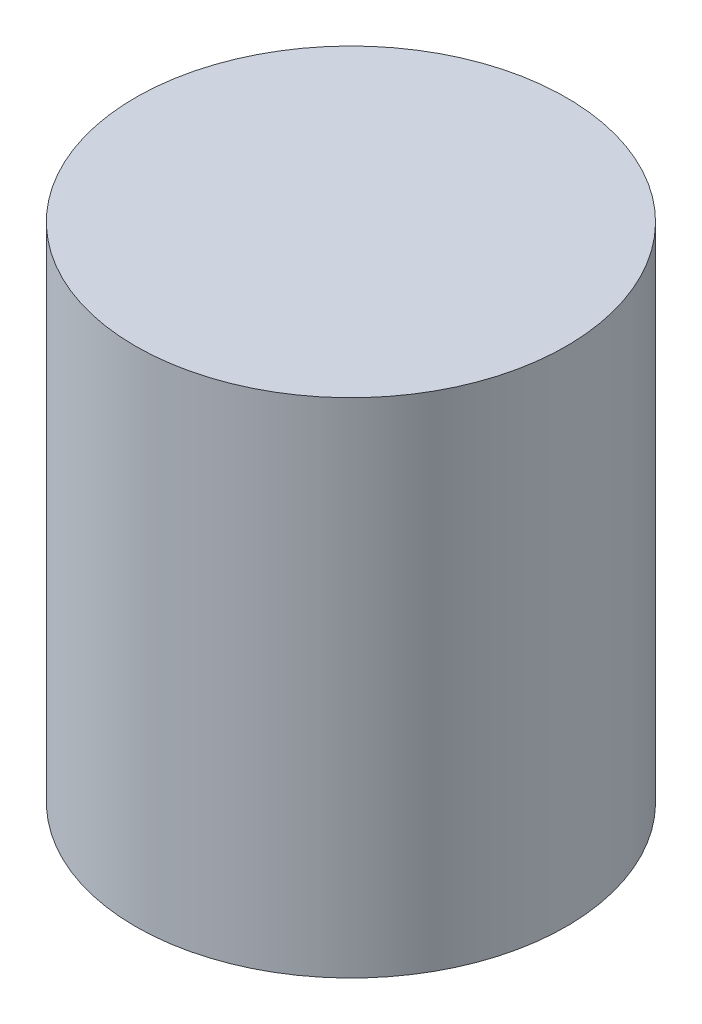
ISO-10303-21;
HEADER;
FILE_DESCRIPTION(('STEP AP214'),'2;1');
FILE_NAME('part.step','',(''),(''),'','','');
FILE_SCHEMA(('AUTOMOTIVE_DESIGN { 1 0 10303 214 1 1 1 1 }'));
ENDSEC;
DATA;
#1=APPLICATION_CONTEXT('core data for automotive mechanical design processes');
#2=APPLICATION_PROTOCOL_DEFINITION('international standard','automotive_design',2000,#1);
#3=PRODUCT_CONTEXT('',#1,'mechanical');
#4=PRODUCT('Part','Part','',(#3));
#5=PRODUCT_RELATED_PRODUCT_CATEGORY('part','',(#4));
#6=PRODUCT_DEFINITION_FORMATION('','',#4);
#7=PRODUCT_DEFINITION_CONTEXT('part definition',#1,'design');
#8=PRODUCT_DEFINITION('design','',#6,#7);
#9=PRODUCT_DEFINITION_SHAPE('','',#8);
#10=(LENGTH_UNIT() NAMED_UNIT(*) SI_UNIT(.MILLI.,.METRE.));
#11=(NAMED_UNIT(*) PLANE_ANGLE_UNIT() SI_UNIT($,.RADIAN.));
#12=(NAMED_UNIT(*) SI_UNIT($,.STERADIAN.) SOLID_ANGLE_UNIT());
#13=UNCERTAINTY_MEASURE_WITH_UNIT(LENGTH_MEASURE(1.E-05),#10,'distance_accuracy_value','');
#14=(GEOMETRIC_REPRESENTATION_CONTEXT(3) GLOBAL_UNCERTAINTY_ASSIGNED_CONTEXT((#13)) GLOBAL_UNIT_ASSIGNED_CONTEXT((#10,
#11,#12)) REPRESENTATION_CONTEXT('',''));
#15=CARTESIAN_POINT('',(0.,0.,0.));
#16=DIRECTION('',(0.,0.,1.));
#17=DIRECTION('',(1.,0.,0.));
#18=AXIS2_PLACEMENT_3D('',#15,#16,#17);
#19=CARTESIAN_POINT('',(0.,7.,0.));
#20=DIRECTION('',(0.,-1.,0.));
#21=DIRECTION('',(0.,0.,-1.));
#22=AXIS2_PLACEMENT_3D('',#19,#20,#21);
#23=CYLINDRICAL_SURFACE('',#22,3.);
#24=CARTESIAN_POINT('',(0.,7.,0.));
#25=DIRECTION('',(0.,1.,0.));
#26=DIRECTION('',(0.,0.,1.));
#27=AXIS2_PLACEMENT_3D('',#24,#25,#26);
#28=CIRCLE('',#27,3.);
#29=CARTESIAN_POINT('',(0.,7.,3.));
#30=VERTEX_POINT('',#29);
#31=EDGE_CURVE('E10',#30,#30,#28,.T.);
#32=ORIENTED_EDGE('',*,*,#31,.F.);
#33=EDGE_LOOP('',(#32));
#34=FACE_BOUND('',#33,.T.);
#35=CARTESIAN_POINT('',(0.,0.,0.));
#36=DIRECTION('',(0.,1.,0.));
#37=DIRECTION('',(0.,0.,1.));
#38=AXIS2_PLACEMENT_3D('',#35,#36,#37);
#39=CIRCLE('',#38,3.);
#40=CARTESIAN_POINT('',(0.,0.,3.));
#41=VERTEX_POINT('',#40);
#42=EDGE_CURVE('E40',#41,#41,#39,.T.);
#43=ORIENTED_EDGE('',*,*,#42,.T.);
#44=EDGE_LOOP('',(#43));
#45=FACE_BOUND('',#44,.T.);
#46=ADVANCED_FACE('F37',(#34,#45),#23,.T.);
#47=CARTESIAN_POINT('',(0.,7.,0.));
#48=DIRECTION('',(0.,1.,0.));
#49=DIRECTION('',(0.,0.,1.));
#50=AXIS2_PLACEMENT_3D('',#47,#48,#49);
#51=PLANE('',#50);
#52=ORIENTED_EDGE('',*,*,#31,.T.);
#53=EDGE_LOOP('',(#52));
#54=FACE_BOUND('',#53,.T.);
#55=ADVANCED_FACE('F54',(#54),#51,.T.);
#56=CARTESIAN_POINT('',(0.,0.,0.));
#57=DIRECTION('',(0.,1.,0.));
#58=DIRECTION('',(0.,0.,1.));
#59=AXIS2_PLACEMENT_3D('',#56,#57,#58);
#60=PLANE('',#59);
#61=ORIENTED_EDGE('',*,*,#42,.F.);
#62=EDGE_LOOP('',(#61));
#63=FACE_BOUND('',#62,.T.);
#64=ADVANCED_FACE('F52',(#63),#60,.F.);
#65=CLOSED_SHELL('',(#46,#55,#64));
#66=MANIFOLD_SOLID_BREP('B2',#65);
#67=ADVANCED_BREP_SHAPE_REPRESENTATION('',(#18,#66),#14);
#68=SHAPE_DEFINITION_REPRESENTATION(#9,#67);
ENDSEC;
END-ISO-10303-21;
